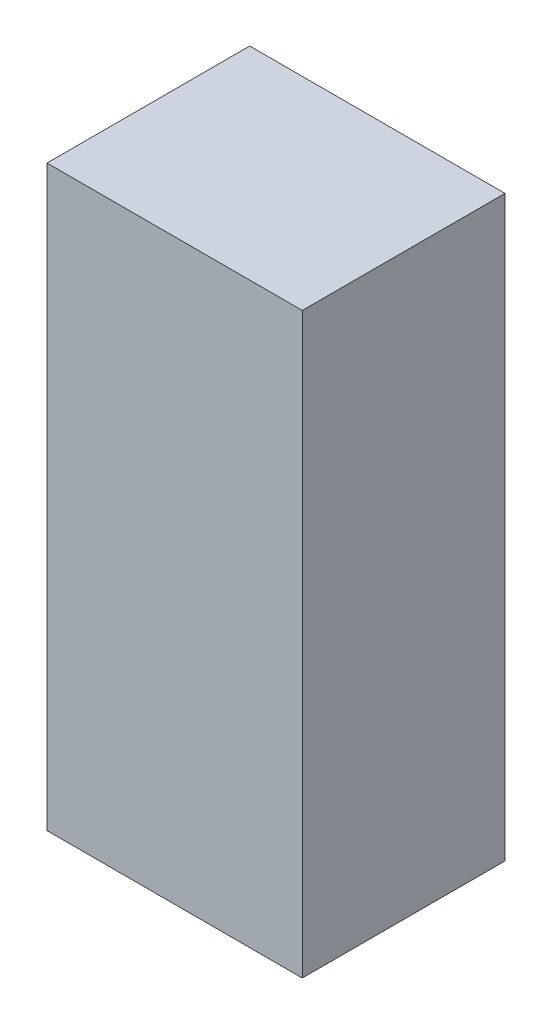
ISO-10303-21;
HEADER;
FILE_DESCRIPTION(('STEP AP214'),'2;1');
FILE_NAME('part.step','',(''),(''),'','','');
FILE_SCHEMA(('AUTOMOTIVE_DESIGN { 1 0 10303 214 1 1 1 1 }'));
ENDSEC;
DATA;
#1=APPLICATION_CONTEXT('core data for automotive mechanical design processes');
#2=APPLICATION_PROTOCOL_DEFINITION('international standard','automotive_design',2000,#1);
#3=PRODUCT_CONTEXT('',#1,'mechanical');
#4=PRODUCT('Part','Part','',(#3));
#5=PRODUCT_RELATED_PRODUCT_CATEGORY('part','',(#4));
#6=PRODUCT_DEFINITION_FORMATION('','',#4);
#7=PRODUCT_DEFINITION_CONTEXT('part definition',#1,'design');
#8=PRODUCT_DEFINITION('design','',#6,#7);
#9=PRODUCT_DEFINITION_SHAPE('','',#8);
#10=(LENGTH_UNIT() NAMED_UNIT(*) SI_UNIT(.MILLI.,.METRE.));
#11=(NAMED_UNIT(*) PLANE_ANGLE_UNIT() SI_UNIT($,.RADIAN.));
#12=(NAMED_UNIT(*) SI_UNIT($,.STERADIAN.) SOLID_ANGLE_UNIT());
#13=UNCERTAINTY_MEASURE_WITH_UNIT(LENGTH_MEASURE(1.E-05),#10,'distance_accuracy_value','');
#14=(GEOMETRIC_REPRESENTATION_CONTEXT(3) GLOBAL_UNCERTAINTY_ASSIGNED_CONTEXT((#13)) GLOBAL_UNIT_ASSIGNED_CONTEXT((#10,
#11,#12)) REPRESENTATION_CONTEXT('',''));
#15=CARTESIAN_POINT('',(0.,0.,0.));
#16=DIRECTION('',(0.,0.,1.));
#17=DIRECTION('',(1.,0.,0.));
#18=AXIS2_PLACEMENT_3D('',#15,#16,#17);
#19=CARTESIAN_POINT('',(17.,38.5,27.));
#20=DIRECTION('',(0.,-1.,0.));
#21=DIRECTION('',(0.,0.,-1.));
#22=AXIS2_PLACEMENT_3D('',#19,#20,#21);
#23=PLANE('',#22);
#24=DIRECTION('',(-1.,0.,0.));
#25=VECTOR('',#24,1.);
#26=CARTESIAN_POINT('',(17.,38.5,0.));
#27=LINE('',#26,#25);
#28=CARTESIAN_POINT('',(17.,38.5,0.));
#29=VERTEX_POINT('',#28);
#30=CARTESIAN_POINT('',(-17.,38.5,0.));
#31=VERTEX_POINT('',#30);
#32=EDGE_CURVE('E111',#29,#31,#27,.T.);
#33=ORIENTED_EDGE('',*,*,#32,.T.);
#34=DIRECTION('',(0.,0.,-1.));
#35=VECTOR('',#34,1.);
#36=CARTESIAN_POINT('',(-17.,38.5,27.));
#37=LINE('',#36,#35);
#38=CARTESIAN_POINT('',(-17.,38.5,27.));
#39=VERTEX_POINT('',#38);
#40=EDGE_CURVE('E11',#39,#31,#37,.T.);
#41=ORIENTED_EDGE('',*,*,#40,.F.);
#42=DIRECTION('',(-1.,0.,0.));
#43=VECTOR('',#42,1.);
#44=CARTESIAN_POINT('',(17.,38.5,27.));
#45=LINE('',#44,#43);
#46=CARTESIAN_POINT('',(17.,38.5,27.));
#47=VERTEX_POINT('',#46);
#48=EDGE_CURVE('E100',#47,#39,#45,.T.);
#49=ORIENTED_EDGE('',*,*,#48,.F.);
#50=DIRECTION('',(0.,0.,-1.));
#51=VECTOR('',#50,1.);
#52=CARTESIAN_POINT('',(17.,38.5,27.));
#53=LINE('',#52,#51);
#54=EDGE_CURVE('E108',#47,#29,#53,.T.);
#55=ORIENTED_EDGE('',*,*,#54,.T.);
#56=EDGE_LOOP('',(#33,#41,#49,#55));
#57=FACE_BOUND('',#56,.T.);
#58=ADVANCED_FACE('F44',(#57),#23,.F.);
#59=CARTESIAN_POINT('',(-17.,-38.5,27.));
#60=DIRECTION('',(1.,0.,0.));
#61=DIRECTION('',(0.,0.,-1.));
#62=AXIS2_PLACEMENT_3D('',#59,#60,#61);
#63=PLANE('',#62);
#64=DIRECTION('',(0.,-1.,0.));
#65=VECTOR('',#64,1.);
#66=CARTESIAN_POINT('',(-17.,-38.5,0.));
#67=LINE('',#66,#65);
#68=CARTESIAN_POINT('',(-17.,-38.5,0.));
#69=VERTEX_POINT('',#68);
#70=EDGE_CURVE('E105',#31,#69,#67,.T.);
#71=ORIENTED_EDGE('',*,*,#70,.T.);
#72=DIRECTION('',(0.,0.,-1.));
#73=VECTOR('',#72,1.);
#74=CARTESIAN_POINT('',(-17.,-38.5,27.));
#75=LINE('',#74,#73);
#76=CARTESIAN_POINT('',(-17.,-38.5,27.));
#77=VERTEX_POINT('',#76);
#78=EDGE_CURVE('E53',#77,#69,#75,.T.);
#79=ORIENTED_EDGE('',*,*,#78,.F.);
#80=DIRECTION('',(0.,-1.,0.));
#81=VECTOR('',#80,1.);
#82=CARTESIAN_POINT('',(-17.,-38.5,27.));
#83=LINE('',#82,#81);
#84=EDGE_CURVE('E95',#39,#77,#83,.T.);
#85=ORIENTED_EDGE('',*,*,#84,.F.);
#86=ORIENTED_EDGE('',*,*,#40,.T.);
#87=EDGE_LOOP('',(#71,#79,#85,#86));
#88=FACE_BOUND('',#87,.T.);
#89=ADVANCED_FACE('F102',(#88),#63,.F.);
#90=CARTESIAN_POINT('',(17.,-38.5,27.));
#91=DIRECTION('',(0.,1.,0.));
#92=DIRECTION('',(0.,0.,1.));
#93=AXIS2_PLACEMENT_3D('',#90,#91,#92);
#94=PLANE('',#93);
#95=DIRECTION('',(1.,0.,0.));
#96=VECTOR('',#95,1.);
#97=CARTESIAN_POINT('',(17.,-38.5,0.));
#98=LINE('',#97,#96);
#99=CARTESIAN_POINT('',(17.,-38.5,0.));
#100=VERTEX_POINT('',#99);
#101=EDGE_CURVE('E80',#69,#100,#98,.T.);
#102=ORIENTED_EDGE('',*,*,#101,.T.);
#103=DIRECTION('',(0.,0.,-1.));
#104=VECTOR('',#103,1.);
#105=CARTESIAN_POINT('',(17.,-38.5,27.));
#106=LINE('',#105,#104);
#107=CARTESIAN_POINT('',(17.,-38.5,27.));
#108=VERTEX_POINT('',#107);
#109=EDGE_CURVE('E101',#108,#100,#106,.T.);
#110=ORIENTED_EDGE('',*,*,#109,.F.);
#111=DIRECTION('',(1.,0.,0.));
#112=VECTOR('',#111,1.);
#113=CARTESIAN_POINT('',(17.,-38.5,27.));
#114=LINE('',#113,#112);
#115=EDGE_CURVE('E94',#77,#108,#114,.T.);
#116=ORIENTED_EDGE('',*,*,#115,.F.);
#117=ORIENTED_EDGE('',*,*,#78,.T.);
#118=EDGE_LOOP('',(#102,#110,#116,#117));
#119=FACE_BOUND('',#118,.T.);
#120=ADVANCED_FACE('F103',(#119),#94,.F.);
#121=CARTESIAN_POINT('',(17.,-38.5,27.));
#122=DIRECTION('',(-1.,0.,0.));
#123=DIRECTION('',(0.,0.,1.));
#124=AXIS2_PLACEMENT_3D('',#121,#122,#123);
#125=PLANE('',#124);
#126=DIRECTION('',(0.,1.,0.));
#127=VECTOR('',#126,1.);
#128=CARTESIAN_POINT('',(17.,-38.5,0.));
#129=LINE('',#128,#127);
#130=EDGE_CURVE('E82',#100,#29,#129,.T.);
#131=ORIENTED_EDGE('',*,*,#130,.T.);
#132=ORIENTED_EDGE('',*,*,#54,.F.);
#133=DIRECTION('',(0.,1.,0.));
#134=VECTOR('',#133,1.);
#135=CARTESIAN_POINT('',(17.,-38.5,27.));
#136=LINE('',#135,#134);
#137=EDGE_CURVE('E62',#108,#47,#136,.T.);
#138=ORIENTED_EDGE('',*,*,#137,.F.);
#139=ORIENTED_EDGE('',*,*,#109,.T.);
#140=EDGE_LOOP('',(#131,#132,#138,#139));
#141=FACE_BOUND('',#140,.T.);
#142=ADVANCED_FACE('F128',(#141),#125,.F.);
#143=CARTESIAN_POINT('',(0.,0.,27.));
#144=DIRECTION('',(0.,0.,-1.));
#145=DIRECTION('',(-1.,0.,0.));
#146=AXIS2_PLACEMENT_3D('',#143,#144,#145);
#147=PLANE('',#146);
#148=ORIENTED_EDGE('',*,*,#48,.T.);
#149=ORIENTED_EDGE('',*,*,#84,.T.);
#150=ORIENTED_EDGE('',*,*,#115,.T.);
#151=ORIENTED_EDGE('',*,*,#137,.T.);
#152=EDGE_LOOP('',(#148,#149,#150,#151));
#153=FACE_BOUND('',#152,.T.);
#154=ADVANCED_FACE('F93',(#153),#147,.F.);
#155=CARTESIAN_POINT('',(0.,0.,0.));
#156=DIRECTION('',(0.,0.,-1.));
#157=DIRECTION('',(-1.,0.,0.));
#158=AXIS2_PLACEMENT_3D('',#155,#156,#157);
#159=PLANE('',#158);
#160=ORIENTED_EDGE('',*,*,#32,.F.);
#161=ORIENTED_EDGE('',*,*,#130,.F.);
#162=ORIENTED_EDGE('',*,*,#101,.F.);
#163=ORIENTED_EDGE('',*,*,#70,.F.);
#164=EDGE_LOOP('',(#160,#161,#162,#163));
#165=FACE_BOUND('',#164,.T.);
#166=ADVANCED_FACE('F129',(#165),#159,.T.);
#167=CLOSED_SHELL('',(#58,#89,#120,#142,#154,#166));
#168=MANIFOLD_SOLID_BREP('B2',#167);
#169=ADVANCED_BREP_SHAPE_REPRESENTATION('',(#18,#168),#14);
#170=SHAPE_DEFINITION_REPRESENTATION(#9,#169);
ENDSEC;
END-ISO-10303-21;
